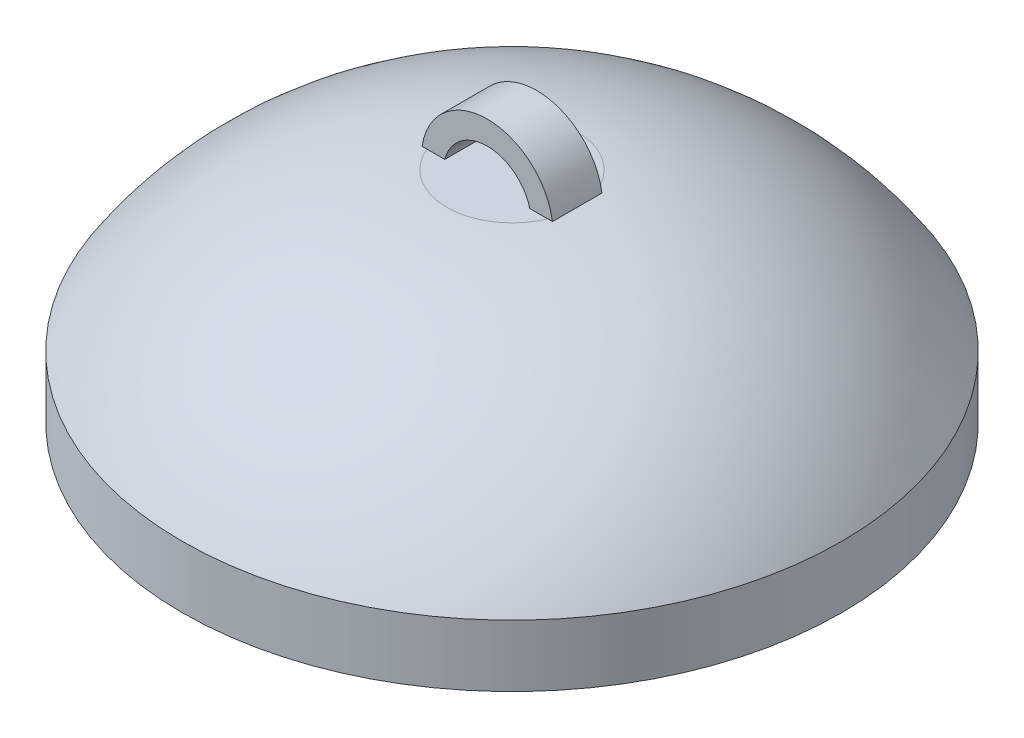
ISO-10303-21;
HEADER;
FILE_DESCRIPTION(('STEP AP214'),'2;1');
FILE_NAME('part.step','',(''),(''),'','','');
FILE_SCHEMA(('AUTOMOTIVE_DESIGN { 1 0 10303 214 1 1 1 1 }'));
ENDSEC;
DATA;
#1=APPLICATION_CONTEXT('core data for automotive mechanical design processes');
#2=APPLICATION_PROTOCOL_DEFINITION('international standard','automotive_design',2000,#1);
#3=PRODUCT_CONTEXT('',#1,'mechanical');
#4=PRODUCT('Part','Part','',(#3));
#5=PRODUCT_RELATED_PRODUCT_CATEGORY('part','',(#4));
#6=PRODUCT_DEFINITION_FORMATION('','',#4);
#7=PRODUCT_DEFINITION_CONTEXT('part definition',#1,'design');
#8=PRODUCT_DEFINITION('design','',#6,#7);
#9=PRODUCT_DEFINITION_SHAPE('','',#8);
#10=(LENGTH_UNIT() NAMED_UNIT(*) SI_UNIT(.MILLI.,.METRE.));
#11=(NAMED_UNIT(*) PLANE_ANGLE_UNIT() SI_UNIT($,.RADIAN.));
#12=(NAMED_UNIT(*) SI_UNIT($,.STERADIAN.) SOLID_ANGLE_UNIT());
#13=UNCERTAINTY_MEASURE_WITH_UNIT(LENGTH_MEASURE(1.E-05),#10,'distance_accuracy_value','');
#14=(GEOMETRIC_REPRESENTATION_CONTEXT(3) GLOBAL_UNCERTAINTY_ASSIGNED_CONTEXT((#13)) GLOBAL_UNIT_ASSIGNED_CONTEXT((#10,
#11,#12)) REPRESENTATION_CONTEXT('',''));
#15=CARTESIAN_POINT('',(0.,0.,0.));
#16=DIRECTION('',(0.,0.,1.));
#17=DIRECTION('',(1.,0.,0.));
#18=AXIS2_PLACEMENT_3D('',#15,#16,#17);
#19=CARTESIAN_POINT('',(0.,53.1048390125155,0.));
#20=DIRECTION('',(0.,-1.,0.));
#21=DIRECTION('',(0.,0.,-1.));
#22=AXIS2_PLACEMENT_3D('',#19,#20,#21);
#23=PLANE('',#22);
#24=DIRECTION('',(1.,0.,0.));
#25=VECTOR('',#24,1.);
#26=CARTESIAN_POINT('',(0.,53.1048390125155,6.));
#27=LINE('',#26,#25);
#28=CARTESIAN_POINT('',(-14.6342796264803,53.1048390125155,6.));
#29=VERTEX_POINT('',#28);
#30=CARTESIAN_POINT('',(-10.3165147926469,53.1048390125155,6.));
#31=VERTEX_POINT('',#30);
#32=EDGE_CURVE('E11',#29,#31,#27,.T.);
#33=ORIENTED_EDGE('',*,*,#32,.F.);
#34=CARTESIAN_POINT('',(0.,53.1048390125155,0.));
#35=DIRECTION('',(0.,-1.,0.));
#36=DIRECTION('',(0.,0.,-1.));
#37=AXIS2_PLACEMENT_3D('',#34,#35,#36);
#38=CIRCLE('',#37,15.8165147926469);
#39=CARTESIAN_POINT('',(14.6342796264803,53.1048390125155,6.));
#40=VERTEX_POINT('',#39);
#41=EDGE_CURVE('E228',#40,#29,#38,.T.);
#42=ORIENTED_EDGE('',*,*,#41,.F.);
#43=DIRECTION('',(1.,0.,0.));
#44=VECTOR('',#43,1.);
#45=CARTESIAN_POINT('',(15.8165147926469,53.1048390125155,6.));
#46=LINE('',#45,#44);
#47=CARTESIAN_POINT('',(10.3165147926469,53.1048390125155,6.));
#48=VERTEX_POINT('',#47);
#49=EDGE_CURVE('E214',#48,#40,#46,.T.);
#50=ORIENTED_EDGE('',*,*,#49,.F.);
#51=DIRECTION('',(0.,0.,-1.));
#52=VECTOR('',#51,1.);
#53=CARTESIAN_POINT('',(10.3165147926469,53.1048390125155,6.));
#54=LINE('',#53,#52);
#55=CARTESIAN_POINT('',(10.3165147926469,53.1048390125155,-6.));
#56=VERTEX_POINT('',#55);
#57=EDGE_CURVE('E201',#48,#56,#54,.T.);
#58=ORIENTED_EDGE('',*,*,#57,.T.);
#59=DIRECTION('',(1.,0.,0.));
#60=VECTOR('',#59,1.);
#61=CARTESIAN_POINT('',(15.8165147926469,53.1048390125155,-6.));
#62=LINE('',#61,#60);
#63=CARTESIAN_POINT('',(14.6342796264803,53.1048390125155,-6.));
#64=VERTEX_POINT('',#63);
#65=EDGE_CURVE('E119',#56,#64,#62,.T.);
#66=ORIENTED_EDGE('',*,*,#65,.T.);
#67=CARTESIAN_POINT('',(-14.6342796264803,53.1048390125155,-6.));
#68=VERTEX_POINT('',#67);
#69=EDGE_CURVE('E148',#68,#64,#38,.T.);
#70=ORIENTED_EDGE('',*,*,#69,.F.);
#71=DIRECTION('',(1.,0.,0.));
#72=VECTOR('',#71,1.);
#73=CARTESIAN_POINT('',(0.,53.1048390125155,-6.));
#74=LINE('',#73,#72);
#75=CARTESIAN_POINT('',(-10.3165147926469,53.1048390125155,-6.));
#76=VERTEX_POINT('',#75);
#77=EDGE_CURVE('E48',#68,#76,#74,.T.);
#78=ORIENTED_EDGE('',*,*,#77,.T.);
#79=DIRECTION('',(0.,0.,-1.));
#80=VECTOR('',#79,1.);
#81=CARTESIAN_POINT('',(-10.3165147926469,53.1048390125155,6.));
#82=LINE('',#81,#80);
#83=EDGE_CURVE('E133',#31,#76,#82,.T.);
#84=ORIENTED_EDGE('',*,*,#83,.F.);
#85=EDGE_LOOP('',(#33,#42,#50,#58,#66,#70,#78,#84));
#86=FACE_BOUND('',#85,.T.);
#87=ADVANCED_FACE('F39',(#86),#23,.F.);
#88=CARTESIAN_POINT('',(0.,0.,0.));
#89=DIRECTION('',(0.,-1.,0.));
#90=DIRECTION('',(0.,0.,-1.));
#91=AXIS2_PLACEMENT_3D('',#88,#89,#90);
#92=CYLINDRICAL_SURFACE('',#91,67.5);
#93=CARTESIAN_POINT('',(0.,0.,0.));
#94=DIRECTION('',(0.,-1.,0.));
#95=DIRECTION('',(0.,0.,-1.));
#96=AXIS2_PLACEMENT_3D('',#93,#94,#95);
#97=CIRCLE('',#96,67.5);
#98=CARTESIAN_POINT('',(0.,0.,-67.5));
#99=VERTEX_POINT('',#98);
#100=EDGE_CURVE('E126',#99,#99,#97,.T.);
#101=ORIENTED_EDGE('',*,*,#100,.F.);
#102=EDGE_LOOP('',(#101));
#103=FACE_BOUND('',#102,.T.);
#104=CARTESIAN_POINT('',(0.,5.,0.));
#105=DIRECTION('',(0.,-1.,0.));
#106=DIRECTION('',(0.,0.,-1.));
#107=AXIS2_PLACEMENT_3D('',#104,#105,#106);
#108=CIRCLE('',#107,67.5);
#109=CARTESIAN_POINT('',(0.,5.,-67.5));
#110=VERTEX_POINT('',#109);
#111=EDGE_CURVE('E170',#110,#110,#108,.T.);
#112=ORIENTED_EDGE('',*,*,#111,.T.);
#113=EDGE_LOOP('',(#112));
#114=FACE_BOUND('',#113,.T.);
#115=ADVANCED_FACE('F41',(#103,#114),#92,.T.);
#116=CARTESIAN_POINT('',(-72.5,5.,0.));
#117=DIRECTION('',(0.,1.,0.));
#118=DIRECTION('',(0.,0.,1.));
#119=AXIS2_PLACEMENT_3D('',#116,#117,#118);
#120=PLANE('',#119);
#121=ORIENTED_EDGE('',*,*,#111,.F.);
#122=EDGE_LOOP('',(#121));
#123=FACE_BOUND('',#122,.T.);
#124=CARTESIAN_POINT('',(0.,5.,0.));
#125=DIRECTION('',(0.,-1.,0.));
#126=DIRECTION('',(0.,0.,-1.));
#127=AXIS2_PLACEMENT_3D('',#124,#125,#126);
#128=CIRCLE('',#127,72.5);
#129=CARTESIAN_POINT('',(0.,5.,-72.5));
#130=VERTEX_POINT('',#129);
#131=EDGE_CURVE('E166',#130,#130,#128,.T.);
#132=ORIENTED_EDGE('',*,*,#131,.T.);
#133=EDGE_LOOP('',(#132));
#134=FACE_BOUND('',#133,.T.);
#135=ADVANCED_FACE('F251',(#123,#134),#120,.F.);
#136=CARTESIAN_POINT('',(0.,0.,0.));
#137=DIRECTION('',(0.,-1.,0.));
#138=DIRECTION('',(0.,0.,-1.));
#139=AXIS2_PLACEMENT_3D('',#136,#137,#138);
#140=CYLINDRICAL_SURFACE('',#139,72.5);
#141=ORIENTED_EDGE('',*,*,#131,.F.);
#142=EDGE_LOOP('',(#141));
#143=FACE_BOUND('',#142,.T.);
#144=CARTESIAN_POINT('',(0.,0.,0.));
#145=DIRECTION('',(0.,-1.,0.));
#146=DIRECTION('',(0.,0.,-1.));
#147=AXIS2_PLACEMENT_3D('',#144,#145,#146);
#148=CIRCLE('',#147,72.5);
#149=CARTESIAN_POINT('',(0.,0.,-72.5));
#150=VERTEX_POINT('',#149);
#151=EDGE_CURVE('E162',#150,#150,#148,.T.);
#152=ORIENTED_EDGE('',*,*,#151,.T.);
#153=EDGE_LOOP('',(#152));
#154=FACE_BOUND('',#153,.T.);
#155=ADVANCED_FACE('F267',(#143,#154),#140,.F.);
#156=CARTESIAN_POINT('',(-80.,0.,0.));
#157=DIRECTION('',(0.,1.,0.));
#158=DIRECTION('',(0.,0.,1.));
#159=AXIS2_PLACEMENT_3D('',#156,#157,#158);
#160=PLANE('',#159);
#161=ORIENTED_EDGE('',*,*,#151,.F.);
#162=EDGE_LOOP('',(#161));
#163=FACE_BOUND('',#162,.T.);
#164=CARTESIAN_POINT('',(0.,0.,0.));
#165=DIRECTION('',(0.,-1.,0.));
#166=DIRECTION('',(0.,0.,-1.));
#167=AXIS2_PLACEMENT_3D('',#164,#165,#166);
#168=CIRCLE('',#167,80.);
#169=CARTESIAN_POINT('',(0.,0.,-80.));
#170=VERTEX_POINT('',#169);
#171=EDGE_CURVE('E158',#170,#170,#168,.T.);
#172=ORIENTED_EDGE('',*,*,#171,.T.);
#173=EDGE_LOOP('',(#172));
#174=FACE_BOUND('',#173,.T.);
#175=ADVANCED_FACE('F263',(#163,#174),#160,.F.);
#176=CARTESIAN_POINT('',(0.,0.,0.));
#177=DIRECTION('',(0.,-1.,0.));
#178=DIRECTION('',(0.,0.,-1.));
#179=AXIS2_PLACEMENT_3D('',#176,#177,#178);
#180=CYLINDRICAL_SURFACE('',#179,80.);
#181=ORIENTED_EDGE('',*,*,#171,.F.);
#182=EDGE_LOOP('',(#181));
#183=FACE_BOUND('',#182,.T.);
#184=CARTESIAN_POINT('',(0.,15.,0.));
#185=DIRECTION('',(0.,-1.,0.));
#186=DIRECTION('',(0.,0.,-1.));
#187=AXIS2_PLACEMENT_3D('',#184,#185,#186);
#188=CIRCLE('',#187,80.);
#189=CARTESIAN_POINT('',(0.,15.,-80.));
#190=VERTEX_POINT('',#189);
#191=EDGE_CURVE('E153',#190,#190,#188,.T.);
#192=ORIENTED_EDGE('',*,*,#191,.T.);
#193=EDGE_LOOP('',(#192));
#194=FACE_BOUND('',#193,.T.);
#195=ADVANCED_FACE('F259',(#183,#194),#180,.T.);
#196=CARTESIAN_POINT('',(0.,-30.2801566845697,0.));
#197=DIRECTION('',(0.,-1.,0.));
#198=DIRECTION('',(0.,0.,-1.));
#199=AXIS2_PLACEMENT_3D('',#196,#197,#198);
#200=DEGENERATE_TOROIDAL_SURFACE('',#199,9.71490514858624,83.6079371091729,.T.);
#201=ORIENTED_EDGE('',*,*,#191,.F.);
#202=EDGE_LOOP('',(#201));
#203=FACE_BOUND('',#202,.T.);
#204=CARTESIAN_POINT('',(15.8165147926469,53.1048390125155,0.));
#205=VERTEX_POINT('',#204);
#206=EDGE_CURVE('E149',#64,#205,#38,.T.);
#207=ORIENTED_EDGE('',*,*,#206,.T.);
#208=EDGE_CURVE('E154',#205,#40,#38,.T.);
#209=ORIENTED_EDGE('',*,*,#208,.T.);
#210=ORIENTED_EDGE('',*,*,#41,.T.);
#211=CARTESIAN_POINT('',(-15.8165147926469,53.1048390125155,0.));
#212=VERTEX_POINT('',#211);
#213=EDGE_CURVE('E104',#29,#212,#38,.T.);
#214=ORIENTED_EDGE('',*,*,#213,.T.);
#215=EDGE_CURVE('E187',#212,#68,#38,.T.);
#216=ORIENTED_EDGE('',*,*,#215,.T.);
#217=ORIENTED_EDGE('',*,*,#69,.T.);
#218=EDGE_LOOP('',(#207,#209,#210,#214,#216,#217));
#219=FACE_BOUND('',#218,.T.);
#220=ADVANCED_FACE('F224',(#203,#219),#200,.T.);
#221=CARTESIAN_POINT('',(-13.7332540333781,40.,0.));
#222=DIRECTION('',(0.,1.,0.));
#223=DIRECTION('',(0.,0.,1.));
#224=AXIS2_PLACEMENT_3D('',#221,#222,#223);
#225=PLANE('',#224);
#226=CARTESIAN_POINT('',(0.,40.,0.));
#227=DIRECTION('',(0.,-1.,0.));
#228=DIRECTION('',(0.,0.,-1.));
#229=AXIS2_PLACEMENT_3D('',#226,#227,#228);
#230=CIRCLE('',#229,13.7332540333781);
#231=CARTESIAN_POINT('',(0.,40.,-13.7332540333781));
#232=VERTEX_POINT('',#231);
#233=EDGE_CURVE('E144',#232,#232,#230,.T.);
#234=ORIENTED_EDGE('',*,*,#233,.T.);
#235=EDGE_LOOP('',(#234));
#236=FACE_BOUND('',#235,.T.);
#237=ADVANCED_FACE('F255',(#236),#225,.F.);
#238=CARTESIAN_POINT('',(0.,-34.8519036355391,0.));
#239=DIRECTION('',(0.,-1.,0.));
#240=DIRECTION('',(0.,0.,-1.));
#241=AXIS2_PLACEMENT_3D('',#238,#239,#240);
#242=DEGENERATE_TOROIDAL_SURFACE('',#241,3.17509418200389,75.5928714715297,.T.);
#243=ORIENTED_EDGE('',*,*,#233,.F.);
#244=EDGE_LOOP('',(#243));
#245=FACE_BOUND('',#244,.T.);
#246=CARTESIAN_POINT('',(0.,15.,0.));
#247=DIRECTION('',(0.,-1.,0.));
#248=DIRECTION('',(0.,0.,-1.));
#249=AXIS2_PLACEMENT_3D('',#246,#247,#248);
#250=CIRCLE('',#249,60.);
#251=CARTESIAN_POINT('',(0.,15.,-60.));
#252=VERTEX_POINT('',#251);
#253=EDGE_CURVE('E140',#252,#252,#250,.T.);
#254=ORIENTED_EDGE('',*,*,#253,.T.);
#255=EDGE_LOOP('',(#254));
#256=FACE_BOUND('',#255,.T.);
#257=ADVANCED_FACE('F310',(#245,#256),#242,.F.);
#258=CARTESIAN_POINT('',(0.,0.,0.));
#259=DIRECTION('',(0.,-1.,0.));
#260=DIRECTION('',(0.,0.,-1.));
#261=AXIS2_PLACEMENT_3D('',#258,#259,#260);
#262=CYLINDRICAL_SURFACE('',#261,60.);
#263=ORIENTED_EDGE('',*,*,#253,.F.);
#264=EDGE_LOOP('',(#263));
#265=FACE_BOUND('',#264,.T.);
#266=CARTESIAN_POINT('',(0.,0.,0.));
#267=DIRECTION('',(0.,-1.,0.));
#268=DIRECTION('',(0.,0.,-1.));
#269=AXIS2_PLACEMENT_3D('',#266,#267,#268);
#270=CIRCLE('',#269,60.);
#271=CARTESIAN_POINT('',(0.,0.,-60.));
#272=VERTEX_POINT('',#271);
#273=EDGE_CURVE('E131',#272,#272,#270,.T.);
#274=ORIENTED_EDGE('',*,*,#273,.T.);
#275=EDGE_LOOP('',(#274));
#276=FACE_BOUND('',#275,.T.);
#277=ADVANCED_FACE('F317',(#265,#276),#262,.F.);
#278=CARTESIAN_POINT('',(-60.,0.,0.));
#279=DIRECTION('',(0.,1.,0.));
#280=DIRECTION('',(0.,0.,1.));
#281=AXIS2_PLACEMENT_3D('',#278,#279,#280);
#282=PLANE('',#281);
#283=ORIENTED_EDGE('',*,*,#273,.F.);
#284=EDGE_LOOP('',(#283));
#285=FACE_BOUND('',#284,.T.);
#286=ORIENTED_EDGE('',*,*,#100,.T.);
#287=EDGE_LOOP('',(#286));
#288=FACE_BOUND('',#287,.T.);
#289=ADVANCED_FACE('F241',(#285,#288),#282,.F.);
#290=CARTESIAN_POINT('',(-15.8165147926469,53.1048390125155,6.));
#291=DIRECTION('',(0.,1.,0.));
#292=DIRECTION('',(0.,0.,1.));
#293=AXIS2_PLACEMENT_3D('',#290,#291,#292);
#294=PLANE('',#293);
#295=DIRECTION('',(1.,0.,0.));
#296=VECTOR('',#295,1.);
#297=CARTESIAN_POINT('',(-15.8165147926469,53.1048390125155,-6.));
#298=LINE('',#297,#296);
#299=CARTESIAN_POINT('',(-15.8165147926469,53.1048390125155,-6.));
#300=VERTEX_POINT('',#299);
#301=EDGE_CURVE('E184',#300,#68,#298,.T.);
#302=ORIENTED_EDGE('',*,*,#301,.T.);
#303=ORIENTED_EDGE('',*,*,#215,.F.);
#304=DIRECTION('',(0.,0.,-1.));
#305=VECTOR('',#304,1.);
#306=CARTESIAN_POINT('',(-15.8165147926469,53.1048390125155,6.));
#307=LINE('',#306,#305);
#308=EDGE_CURVE('E124',#212,#300,#307,.T.);
#309=ORIENTED_EDGE('',*,*,#308,.T.);
#310=EDGE_LOOP('',(#302,#303,#309));
#311=FACE_BOUND('',#310,.T.);
#312=ADVANCED_FACE('F186',(#311),#294,.F.);
#313=CARTESIAN_POINT('',(15.8165147926469,53.1048390125155,6.));
#314=DIRECTION('',(0.,1.,0.));
#315=DIRECTION('',(0.,0.,1.));
#316=AXIS2_PLACEMENT_3D('',#313,#314,#315);
#317=PLANE('',#316);
#318=CARTESIAN_POINT('',(15.8165147926469,53.1048390125155,6.));
#319=VERTEX_POINT('',#318);
#320=EDGE_CURVE('E114',#40,#319,#46,.T.);
#321=ORIENTED_EDGE('',*,*,#320,.F.);
#322=ORIENTED_EDGE('',*,*,#208,.F.);
#323=DIRECTION('',(0.,0.,-1.));
#324=VECTOR('',#323,1.);
#325=CARTESIAN_POINT('',(15.8165147926469,53.1048390125155,6.));
#326=LINE('',#325,#324);
#327=EDGE_CURVE('E199',#319,#205,#326,.T.);
#328=ORIENTED_EDGE('',*,*,#327,.F.);
#329=EDGE_LOOP('',(#321,#322,#328));
#330=FACE_BOUND('',#329,.T.);
#331=ADVANCED_FACE('F233',(#330),#317,.F.);
#332=CARTESIAN_POINT('',(0.,50.7659453000996,6.));
#333=DIRECTION('',(0.,0.,-1.));
#334=DIRECTION('',(-1.,0.,0.));
#335=AXIS2_PLACEMENT_3D('',#332,#333,#334);
#336=CYLINDRICAL_SURFACE('',#335,15.9885135013858);
#337=CARTESIAN_POINT('',(0.,50.7659453000996,-6.));
#338=DIRECTION('',(0.,0.,1.));
#339=DIRECTION('',(-1.,0.,0.));
#340=AXIS2_PLACEMENT_3D('',#337,#338,#339);
#341=CIRCLE('',#340,15.9885135013858);
#342=CARTESIAN_POINT('',(15.8165147926469,53.1048390125155,-6.));
#343=VERTEX_POINT('',#342);
#344=EDGE_CURVE('E189',#343,#300,#341,.T.);
#345=ORIENTED_EDGE('',*,*,#344,.T.);
#346=ORIENTED_EDGE('',*,*,#308,.F.);
#347=CARTESIAN_POINT('',(-15.8165147926469,53.1048390125155,6.));
#348=VERTEX_POINT('',#347);
#349=EDGE_CURVE('E102',#348,#212,#307,.T.);
#350=ORIENTED_EDGE('',*,*,#349,.F.);
#351=CARTESIAN_POINT('',(0.,50.7659453000996,6.));
#352=DIRECTION('',(0.,0.,1.));
#353=DIRECTION('',(-1.,0.,0.));
#354=AXIS2_PLACEMENT_3D('',#351,#352,#353);
#355=CIRCLE('',#354,15.9885135013858);
#356=EDGE_CURVE('E109',#319,#348,#355,.T.);
#357=ORIENTED_EDGE('',*,*,#356,.F.);
#358=ORIENTED_EDGE('',*,*,#327,.T.);
#359=EDGE_CURVE('E202',#205,#343,#326,.T.);
#360=ORIENTED_EDGE('',*,*,#359,.T.);
#361=EDGE_LOOP('',(#345,#346,#350,#357,#358,#360));
#362=FACE_BOUND('',#361,.T.);
#363=ADVANCED_FACE('F123',(#362),#336,.T.);
#364=ORIENTED_EDGE('',*,*,#349,.T.);
#365=ORIENTED_EDGE('',*,*,#213,.F.);
#366=DIRECTION('',(1.,0.,0.));
#367=VECTOR('',#366,1.);
#368=CARTESIAN_POINT('',(-15.8165147926469,53.1048390125155,6.));
#369=LINE('',#368,#367);
#370=EDGE_CURVE('E98',#348,#29,#369,.T.);
#371=ORIENTED_EDGE('',*,*,#370,.F.);
#372=EDGE_LOOP('',(#364,#365,#371));
#373=FACE_BOUND('',#372,.T.);
#374=ADVANCED_FACE('F100',(#373),#294,.F.);
#375=CARTESIAN_POINT('',(0.,50.4003859582704,6.));
#376=DIRECTION('',(0.,0.,-1.));
#377=DIRECTION('',(-1.,0.,0.));
#378=AXIS2_PLACEMENT_3D('',#375,#376,#377);
#379=CYLINDRICAL_SURFACE('',#378,10.6651087096905);
#380=CARTESIAN_POINT('',(0.,50.4003859582704,-6.));
#381=DIRECTION('',(0.,0.,-1.));
#382=DIRECTION('',(-1.,0.,0.));
#383=AXIS2_PLACEMENT_3D('',#380,#381,#382);
#384=CIRCLE('',#383,10.6651087096905);
#385=EDGE_CURVE('E55',#76,#56,#384,.T.);
#386=ORIENTED_EDGE('',*,*,#385,.T.);
#387=ORIENTED_EDGE('',*,*,#57,.F.);
#388=CARTESIAN_POINT('',(0.,50.4003859582704,6.));
#389=DIRECTION('',(0.,0.,-1.));
#390=DIRECTION('',(-1.,0.,0.));
#391=AXIS2_PLACEMENT_3D('',#388,#389,#390);
#392=CIRCLE('',#391,10.6651087096905);
#393=EDGE_CURVE('E108',#31,#48,#392,.T.);
#394=ORIENTED_EDGE('',*,*,#393,.F.);
#395=ORIENTED_EDGE('',*,*,#83,.T.);
#396=EDGE_LOOP('',(#386,#387,#394,#395));
#397=FACE_BOUND('',#396,.T.);
#398=ADVANCED_FACE('F210',(#397),#379,.F.);
#399=ORIENTED_EDGE('',*,*,#359,.F.);
#400=ORIENTED_EDGE('',*,*,#206,.F.);
#401=EDGE_CURVE('E61',#64,#343,#62,.T.);
#402=ORIENTED_EDGE('',*,*,#401,.T.);
#403=EDGE_LOOP('',(#399,#400,#402));
#404=FACE_BOUND('',#403,.T.);
#405=ADVANCED_FACE('F220',(#404),#317,.F.);
#406=CARTESIAN_POINT('',(0.,50.7659453000996,6.));
#407=DIRECTION('',(0.,0.,-1.));
#408=DIRECTION('',(-1.,0.,0.));
#409=AXIS2_PLACEMENT_3D('',#406,#407,#408);
#410=PLANE('',#409);
#411=ORIENTED_EDGE('',*,*,#356,.T.);
#412=ORIENTED_EDGE('',*,*,#370,.T.);
#413=ORIENTED_EDGE('',*,*,#32,.T.);
#414=ORIENTED_EDGE('',*,*,#393,.T.);
#415=ORIENTED_EDGE('',*,*,#49,.T.);
#416=ORIENTED_EDGE('',*,*,#320,.T.);
#417=EDGE_LOOP('',(#411,#412,#413,#414,#415,#416));
#418=FACE_BOUND('',#417,.T.);
#419=ADVANCED_FACE('F112',(#418),#410,.F.);
#420=CARTESIAN_POINT('',(0.,50.7659453000996,-6.));
#421=DIRECTION('',(0.,0.,-1.));
#422=DIRECTION('',(-1.,0.,0.));
#423=AXIS2_PLACEMENT_3D('',#420,#421,#422);
#424=PLANE('',#423);
#425=ORIENTED_EDGE('',*,*,#344,.F.);
#426=ORIENTED_EDGE('',*,*,#401,.F.);
#427=ORIENTED_EDGE('',*,*,#65,.F.);
#428=ORIENTED_EDGE('',*,*,#385,.F.);
#429=ORIENTED_EDGE('',*,*,#77,.F.);
#430=ORIENTED_EDGE('',*,*,#301,.F.);
#431=EDGE_LOOP('',(#425,#426,#427,#428,#429,#430));
#432=FACE_BOUND('',#431,.T.);
#433=ADVANCED_FACE('F183',(#432),#424,.T.);
#434=CLOSED_SHELL('',(#87,#115,#135,#155,#175,#195,#220,#237,#257,#277,#289,#312,#331,#363,#374,
#398,#405,#419,#433));
#435=MANIFOLD_SOLID_BREP('B2',#434);
#436=ADVANCED_BREP_SHAPE_REPRESENTATION('',(#18,#435),#14);
#437=SHAPE_DEFINITION_REPRESENTATION(#9,#436);
ENDSEC;
END-ISO-10303-21;
